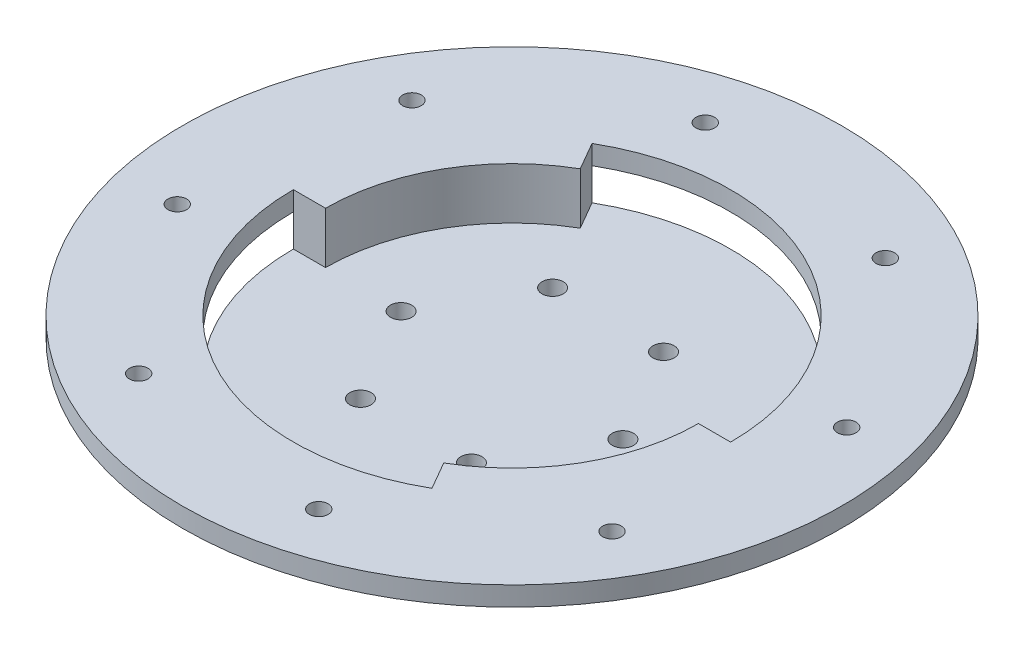
ISO-10303-21;
HEADER;
FILE_DESCRIPTION(('STEP AP214'),'2;1');
FILE_NAME('part.step','',(''),(''),'','','');
FILE_SCHEMA(('AUTOMOTIVE_DESIGN { 1 0 10303 214 1 1 1 1 }'));
ENDSEC;
DATA;
#1=APPLICATION_CONTEXT('core data for automotive mechanical design processes');
#2=APPLICATION_PROTOCOL_DEFINITION('international standard','automotive_design',2000,#1);
#3=PRODUCT_CONTEXT('',#1,'mechanical');
#4=PRODUCT('Part','Part','',(#3));
#5=PRODUCT_RELATED_PRODUCT_CATEGORY('part','',(#4));
#6=PRODUCT_DEFINITION_FORMATION('','',#4);
#7=PRODUCT_DEFINITION_CONTEXT('part definition',#1,'design');
#8=PRODUCT_DEFINITION('design','',#6,#7);
#9=PRODUCT_DEFINITION_SHAPE('','',#8);
#10=(LENGTH_UNIT() NAMED_UNIT(*) SI_UNIT(.MILLI.,.METRE.));
#11=(NAMED_UNIT(*) PLANE_ANGLE_UNIT() SI_UNIT($,.RADIAN.));
#12=(NAMED_UNIT(*) SI_UNIT($,.STERADIAN.) SOLID_ANGLE_UNIT());
#13=UNCERTAINTY_MEASURE_WITH_UNIT(LENGTH_MEASURE(1.E-05),#10,'distance_accuracy_value','');
#14=(GEOMETRIC_REPRESENTATION_CONTEXT(3) GLOBAL_UNCERTAINTY_ASSIGNED_CONTEXT((#13)) GLOBAL_UNIT_ASSIGNED_CONTEXT((#10,
#11,#12)) REPRESENTATION_CONTEXT('',''));
#15=CARTESIAN_POINT('',(0.,0.,0.));
#16=DIRECTION('',(0.,0.,1.));
#17=DIRECTION('',(1.,0.,0.));
#18=AXIS2_PLACEMENT_3D('',#15,#16,#17);
#19=CARTESIAN_POINT('',(0.,10.,0.));
#20=DIRECTION('',(0.,1.,0.));
#21=DIRECTION('',(0.,0.,1.));
#22=AXIS2_PLACEMENT_3D('',#19,#20,#21);
#23=CYLINDRICAL_SURFACE('',#22,51.25);
#24=CARTESIAN_POINT('',(0.,10.,0.));
#25=DIRECTION('',(0.,1.,0.));
#26=DIRECTION('',(0.,0.,1.));
#27=AXIS2_PLACEMENT_3D('',#24,#25,#26);
#28=CIRCLE('',#27,51.25);
#29=CARTESIAN_POINT('',(0.,10.,51.25));
#30=VERTEX_POINT('',#29);
#31=EDGE_CURVE('E212',#30,#30,#28,.T.);
#32=ORIENTED_EDGE('',*,*,#31,.T.);
#33=EDGE_LOOP('',(#32));
#34=FACE_BOUND('',#33,.T.);
#35=CARTESIAN_POINT('',(0.,13.,0.));
#36=DIRECTION('',(0.,1.,0.));
#37=DIRECTION('',(0.,0.,1.));
#38=AXIS2_PLACEMENT_3D('',#35,#36,#37);
#39=CIRCLE('',#38,51.25);
#40=CARTESIAN_POINT('',(0.,13.,51.25));
#41=VERTEX_POINT('',#40);
#42=EDGE_CURVE('E834',#41,#41,#39,.F.);
#43=ORIENTED_EDGE('',*,*,#42,.T.);
#44=EDGE_LOOP('',(#43));
#45=FACE_BOUND('',#44,.T.);
#46=ADVANCED_FACE('F45',(#34,#45),#23,.T.);
#47=CARTESIAN_POINT('',(0.,10.,0.));
#48=DIRECTION('',(0.,1.,0.));
#49=DIRECTION('',(0.,0.,1.));
#50=AXIS2_PLACEMENT_3D('',#47,#48,#49);
#51=PLANE('',#50);
#52=CARTESIAN_POINT('',(10.9998094168576,10.,41.0518476172853));
#53=DIRECTION('',(0.,-1.,0.));
#54=DIRECTION('',(0.,0.,-1.));
#55=AXIS2_PLACEMENT_3D('',#52,#53,#54);
#56=CIRCLE('',#55,1.775);
#57=CARTESIAN_POINT('',(10.9998094168576,10.,39.2768476172853));
#58=VERTEX_POINT('',#57);
#59=EDGE_CURVE('E833',#58,#58,#56,.T.);
#60=ORIENTED_EDGE('',*,*,#59,.F.);
#61=EDGE_LOOP('',(#60));
#62=FACE_BOUND('',#61,.T.);
#63=CARTESIAN_POINT('',(-21.2499999999997,10.,36.8060796608388));
#64=DIRECTION('',(0.,-1.,0.));
#65=DIRECTION('',(0.,0.,-1.));
#66=AXIS2_PLACEMENT_3D('',#63,#64,#65);
#67=CIRCLE('',#66,1.775);
#68=CARTESIAN_POINT('',(-21.2499999999997,10.,35.0310796608388));
#69=VERTEX_POINT('',#68);
#70=EDGE_CURVE('E277',#69,#69,#67,.T.);
#71=ORIENTED_EDGE('',*,*,#70,.F.);
#72=EDGE_LOOP('',(#71));
#73=FACE_BOUND('',#72,.T.);
#74=CARTESIAN_POINT('',(-36.8060796608386,10.,-21.25));
#75=DIRECTION('',(0.,-1.,0.));
#76=DIRECTION('',(0.,0.,-1.));
#77=AXIS2_PLACEMENT_3D('',#74,#75,#76);
#78=CIRCLE('',#77,1.775);
#79=CARTESIAN_POINT('',(-36.8060796608386,10.,-23.025));
#80=VERTEX_POINT('',#79);
#81=EDGE_CURVE('E266',#80,#80,#78,.T.);
#82=ORIENTED_EDGE('',*,*,#81,.F.);
#83=EDGE_LOOP('',(#82));
#84=FACE_BOUND('',#83,.T.);
#85=CARTESIAN_POINT('',(-10.9998094168573,10.,-41.0518476172854));
#86=DIRECTION('',(0.,-1.,0.));
#87=DIRECTION('',(0.,0.,-1.));
#88=AXIS2_PLACEMENT_3D('',#85,#86,#87);
#89=CIRCLE('',#88,1.775);
#90=CARTESIAN_POINT('',(-10.9998094168573,10.,-42.8268476172854));
#91=VERTEX_POINT('',#90);
#92=EDGE_CURVE('E262',#91,#91,#89,.T.);
#93=ORIENTED_EDGE('',*,*,#92,.F.);
#94=EDGE_LOOP('',(#93));
#95=FACE_BOUND('',#94,.T.);
#96=CARTESIAN_POINT('',(21.2499999999999,10.,-36.8060796608387));
#97=DIRECTION('',(0.,-1.,0.));
#98=DIRECTION('',(0.,0.,-1.));
#99=AXIS2_PLACEMENT_3D('',#96,#97,#98);
#100=CIRCLE('',#99,1.775);
#101=CARTESIAN_POINT('',(21.2499999999999,10.,-38.5810796608387));
#102=VERTEX_POINT('',#101);
#103=EDGE_CURVE('E257',#102,#102,#100,.T.);
#104=ORIENTED_EDGE('',*,*,#103,.F.);
#105=EDGE_LOOP('',(#104));
#106=FACE_BOUND('',#105,.T.);
#107=CARTESIAN_POINT('',(41.0518476172854,10.,-10.9998094168572));
#108=DIRECTION('',(0.,-1.,0.));
#109=DIRECTION('',(0.,0.,-1.));
#110=AXIS2_PLACEMENT_3D('',#107,#108,#109);
#111=CIRCLE('',#110,1.775);
#112=CARTESIAN_POINT('',(41.0518476172854,10.,-12.7748094168572));
#113=VERTEX_POINT('',#112);
#114=EDGE_CURVE('E252',#113,#113,#111,.T.);
#115=ORIENTED_EDGE('',*,*,#114,.F.);
#116=EDGE_LOOP('',(#115));
#117=FACE_BOUND('',#116,.T.);
#118=CARTESIAN_POINT('',(36.8060796608386,10.,21.25));
#119=DIRECTION('',(0.,-1.,0.));
#120=DIRECTION('',(0.,0.,-1.));
#121=AXIS2_PLACEMENT_3D('',#118,#119,#120);
#122=CIRCLE('',#121,1.775);
#123=CARTESIAN_POINT('',(36.8060796608386,10.,19.475));
#124=VERTEX_POINT('',#123);
#125=EDGE_CURVE('E247',#124,#124,#122,.T.);
#126=ORIENTED_EDGE('',*,*,#125,.F.);
#127=EDGE_LOOP('',(#126));
#128=FACE_BOUND('',#127,.T.);
#129=CARTESIAN_POINT('',(0.,10.,0.));
#130=DIRECTION('',(0.,1.,0.));
#131=DIRECTION('',(0.,0.,1.));
#132=AXIS2_PLACEMENT_3D('',#129,#130,#131);
#133=CIRCLE('',#132,34.);
#134=CARTESIAN_POINT('',(16.9999999999999,10.,29.444863728671));
#135=VERTEX_POINT('',#134);
#136=CARTESIAN_POINT('',(34.,10.,0.));
#137=VERTEX_POINT('',#136);
#138=EDGE_CURVE('E143',#135,#137,#133,.T.);
#139=ORIENTED_EDGE('',*,*,#138,.T.);
#140=CARTESIAN_POINT('',(-17.0000000000001,10.,-29.4448637286708));
#141=VERTEX_POINT('',#140);
#142=EDGE_CURVE('E154',#137,#141,#133,.T.);
#143=ORIENTED_EDGE('',*,*,#142,.T.);
#144=CARTESIAN_POINT('',(-34.,10.,0.));
#145=VERTEX_POINT('',#144);
#146=EDGE_CURVE('E145',#141,#145,#133,.T.);
#147=ORIENTED_EDGE('',*,*,#146,.T.);
#148=EDGE_CURVE('E129',#145,#135,#133,.T.);
#149=ORIENTED_EDGE('',*,*,#148,.T.);
#150=EDGE_LOOP('',(#139,#143,#147,#149));
#151=FACE_BOUND('',#150,.T.);
#152=ORIENTED_EDGE('',*,*,#31,.F.);
#153=EDGE_LOOP('',(#152));
#154=FACE_BOUND('',#153,.T.);
#155=CARTESIAN_POINT('',(-41.0518476172853,10.,10.9998094168574));
#156=DIRECTION('',(0.,-1.,0.));
#157=DIRECTION('',(0.,0.,-1.));
#158=AXIS2_PLACEMENT_3D('',#155,#156,#157);
#159=CIRCLE('',#158,1.775);
#160=CARTESIAN_POINT('',(-41.0518476172853,10.,9.22480941685744));
#161=VERTEX_POINT('',#160);
#162=EDGE_CURVE('E270',#161,#161,#159,.T.);
#163=ORIENTED_EDGE('',*,*,#162,.F.);
#164=EDGE_LOOP('',(#163));
#165=FACE_BOUND('',#164,.T.);
#166=ADVANCED_FACE('F140',(#62,#73,#84,#95,#106,#117,#128,#151,#154,#165),#51,.F.);
#167=CARTESIAN_POINT('',(0.,5.,0.));
#168=DIRECTION('',(0.,-1.,0.));
#169=DIRECTION('',(0.,0.,-1.));
#170=AXIS2_PLACEMENT_3D('',#167,#168,#169);
#171=CYLINDRICAL_SURFACE('',#170,34.);
#172=CARTESIAN_POINT('',(0.,0.,0.));
#173=DIRECTION('',(0.,1.,0.));
#174=DIRECTION('',(0.,0.,1.));
#175=AXIS2_PLACEMENT_3D('',#172,#173,#174);
#176=CIRCLE('',#175,34.);
#177=CARTESIAN_POINT('',(0.,0.,34.));
#178=VERTEX_POINT('',#177);
#179=EDGE_CURVE('E205',#178,#178,#176,.T.);
#180=ORIENTED_EDGE('',*,*,#179,.T.);
#181=EDGE_LOOP('',(#180));
#182=FACE_BOUND('',#181,.T.);
#183=ORIENTED_EDGE('',*,*,#138,.F.);
#184=DIRECTION('',(0.,-1.,0.));
#185=VECTOR('',#184,1.);
#186=CARTESIAN_POINT('',(16.9999999999999,13.,29.444863728671));
#187=LINE('',#186,#185);
#188=CARTESIAN_POINT('',(16.9999999999999,5.,29.444863728671));
#189=VERTEX_POINT('',#188);
#190=EDGE_CURVE('E135',#135,#189,#187,.T.);
#191=ORIENTED_EDGE('',*,*,#190,.T.);
#192=CARTESIAN_POINT('',(0.,5.,0.));
#193=DIRECTION('',(0.,1.,0.));
#194=DIRECTION('',(0.,0.,1.));
#195=AXIS2_PLACEMENT_3D('',#192,#193,#194);
#196=CIRCLE('',#195,34.);
#197=CARTESIAN_POINT('',(-34.,5.,0.));
#198=VERTEX_POINT('',#197);
#199=EDGE_CURVE('E11',#198,#189,#196,.T.);
#200=ORIENTED_EDGE('',*,*,#199,.F.);
#201=DIRECTION('',(0.,-1.,0.));
#202=VECTOR('',#201,1.);
#203=CARTESIAN_POINT('',(-34.,13.,0.));
#204=LINE('',#203,#202);
#205=EDGE_CURVE('E196',#145,#198,#204,.T.);
#206=ORIENTED_EDGE('',*,*,#205,.F.);
#207=ORIENTED_EDGE('',*,*,#146,.F.);
#208=DIRECTION('',(0.,-1.,0.));
#209=VECTOR('',#208,1.);
#210=CARTESIAN_POINT('',(-17.0000000000001,13.,-29.4448637286708));
#211=LINE('',#210,#209);
#212=CARTESIAN_POINT('',(-17.0000000000001,5.,-29.4448637286708));
#213=VERTEX_POINT('',#212);
#214=EDGE_CURVE('E200',#141,#213,#211,.T.);
#215=ORIENTED_EDGE('',*,*,#214,.T.);
#216=CARTESIAN_POINT('',(34.,5.,0.));
#217=VERTEX_POINT('',#216);
#218=EDGE_CURVE('E54',#217,#213,#196,.T.);
#219=ORIENTED_EDGE('',*,*,#218,.F.);
#220=DIRECTION('',(0.,-1.,0.));
#221=VECTOR('',#220,1.);
#222=CARTESIAN_POINT('',(34.,13.,0.));
#223=LINE('',#222,#221);
#224=EDGE_CURVE('E62',#137,#217,#223,.T.);
#225=ORIENTED_EDGE('',*,*,#224,.F.);
#226=EDGE_LOOP('',(#183,#191,#200,#206,#207,#215,#219,#225));
#227=FACE_BOUND('',#226,.T.);
#228=ADVANCED_FACE('F47',(#182,#227),#171,.T.);
#229=CARTESIAN_POINT('',(0.,5.,0.));
#230=DIRECTION('',(0.,1.,0.));
#231=DIRECTION('',(0.,0.,1.));
#232=AXIS2_PLACEMENT_3D('',#229,#230,#231);
#233=PLANE('',#232);
#234=CARTESIAN_POINT('',(17.25,5.,-2.40259201422788E-13));
#235=DIRECTION('',(0.,1.,0.));
#236=DIRECTION('',(0.,0.,1.));
#237=AXIS2_PLACEMENT_3D('',#234,#235,#236);
#238=CIRCLE('',#237,1.65);
#239=CARTESIAN_POINT('',(17.25,5.,1.64999999999976));
#240=VERTEX_POINT('',#239);
#241=EDGE_CURVE('E234',#240,#240,#238,.T.);
#242=ORIENTED_EDGE('',*,*,#241,.F.);
#243=EDGE_LOOP('',(#242));
#244=FACE_BOUND('',#243,.T.);
#245=CARTESIAN_POINT('',(8.62500000000017,5.,14.9389382152815));
#246=DIRECTION('',(0.,1.,0.));
#247=DIRECTION('',(0.,0.,1.));
#248=AXIS2_PLACEMENT_3D('',#245,#246,#247);
#249=CIRCLE('',#248,1.65);
#250=CARTESIAN_POINT('',(8.62500000000017,5.,16.5889382152815));
#251=VERTEX_POINT('',#250);
#252=EDGE_CURVE('E229',#251,#251,#249,.T.);
#253=ORIENTED_EDGE('',*,*,#252,.F.);
#254=EDGE_LOOP('',(#253));
#255=FACE_BOUND('',#254,.T.);
#256=CARTESIAN_POINT('',(-8.62499999999996,5.,14.9389382152816));
#257=DIRECTION('',(0.,1.,0.));
#258=DIRECTION('',(0.,0.,1.));
#259=AXIS2_PLACEMENT_3D('',#256,#257,#258);
#260=CIRCLE('',#259,1.65);
#261=CARTESIAN_POINT('',(-8.62499999999996,5.,16.5889382152816));
#262=VERTEX_POINT('',#261);
#263=EDGE_CURVE('E224',#262,#262,#260,.T.);
#264=ORIENTED_EDGE('',*,*,#263,.F.);
#265=EDGE_LOOP('',(#264));
#266=FACE_BOUND('',#265,.T.);
#267=CARTESIAN_POINT('',(-17.25,5.,1.196959198424E-13));
#268=DIRECTION('',(0.,1.,0.));
#269=DIRECTION('',(0.,0.,1.));
#270=AXIS2_PLACEMENT_3D('',#267,#268,#269);
#271=CIRCLE('',#270,1.65);
#272=CARTESIAN_POINT('',(-17.25,5.,1.65000000000012));
#273=VERTEX_POINT('',#272);
#274=EDGE_CURVE('E219',#273,#273,#271,.T.);
#275=ORIENTED_EDGE('',*,*,#274,.F.);
#276=EDGE_LOOP('',(#275));
#277=FACE_BOUND('',#276,.T.);
#278=CARTESIAN_POINT('',(-8.62500000000007,5.,-14.9389382152815));
#279=DIRECTION('',(0.,1.,0.));
#280=DIRECTION('',(0.,0.,1.));
#281=AXIS2_PLACEMENT_3D('',#278,#279,#280);
#282=CIRCLE('',#281,1.65);
#283=CARTESIAN_POINT('',(-8.62500000000007,5.,-13.2889382152815));
#284=VERTEX_POINT('',#283);
#285=EDGE_CURVE('E214',#284,#284,#282,.T.);
#286=ORIENTED_EDGE('',*,*,#285,.F.);
#287=EDGE_LOOP('',(#286));
#288=FACE_BOUND('',#287,.T.);
#289=CARTESIAN_POINT('',(8.62499999999996,5.,-14.9389382152816));
#290=DIRECTION('',(0.,1.,0.));
#291=DIRECTION('',(0.,0.,1.));
#292=AXIS2_PLACEMENT_3D('',#289,#290,#291);
#293=CIRCLE('',#292,1.65);
#294=CARTESIAN_POINT('',(8.62499999999996,5.,-13.2889382152816));
#295=VERTEX_POINT('',#294);
#296=EDGE_CURVE('E209',#295,#295,#293,.T.);
#297=ORIENTED_EDGE('',*,*,#296,.F.);
#298=EDGE_LOOP('',(#297));
#299=FACE_BOUND('',#298,.T.);
#300=ORIENTED_EDGE('',*,*,#199,.T.);
#301=DIRECTION('',(0.499999999999998,0.,0.86602540378444));
#302=VECTOR('',#301,1.);
#303=CARTESIAN_POINT('',(14.4999999999999,5.,25.1147367097488));
#304=LINE('',#303,#302);
#305=CARTESIAN_POINT('',(14.4999999999999,5.,25.1147367097488));
#306=VERTEX_POINT('',#305);
#307=EDGE_CURVE('E157',#306,#189,#304,.T.);
#308=ORIENTED_EDGE('',*,*,#307,.F.);
#309=CARTESIAN_POINT('',(0.,5.,0.));
#310=DIRECTION('',(0.,-1.,0.));
#311=DIRECTION('',(0.,0.,1.));
#312=AXIS2_PLACEMENT_3D('',#309,#310,#311);
#313=CIRCLE('',#312,29.);
#314=CARTESIAN_POINT('',(29.,5.,0.));
#315=VERTEX_POINT('',#314);
#316=EDGE_CURVE('E171',#315,#306,#313,.T.);
#317=ORIENTED_EDGE('',*,*,#316,.F.);
#318=DIRECTION('',(-1.,0.,0.));
#319=VECTOR('',#318,1.);
#320=CARTESIAN_POINT('',(29.,5.,0.));
#321=LINE('',#320,#319);
#322=EDGE_CURVE('E167',#217,#315,#321,.T.);
#323=ORIENTED_EDGE('',*,*,#322,.F.);
#324=ORIENTED_EDGE('',*,*,#218,.T.);
#325=DIRECTION('',(-0.500000000000004,0.,-0.866025403784436));
#326=VECTOR('',#325,1.);
#327=CARTESIAN_POINT('',(-14.5000000000001,5.,-25.1147367097487));
#328=LINE('',#327,#326);
#329=CARTESIAN_POINT('',(-14.5000000000001,5.,-25.1147367097487));
#330=VERTEX_POINT('',#329);
#331=EDGE_CURVE('E190',#330,#213,#328,.T.);
#332=ORIENTED_EDGE('',*,*,#331,.F.);
#333=CARTESIAN_POINT('',(0.,5.,0.));
#334=DIRECTION('',(0.,-1.,0.));
#335=DIRECTION('',(0.,0.,1.));
#336=AXIS2_PLACEMENT_3D('',#333,#334,#335);
#337=CIRCLE('',#336,29.);
#338=CARTESIAN_POINT('',(-29.,5.,0.));
#339=VERTEX_POINT('',#338);
#340=EDGE_CURVE('E70',#339,#330,#337,.T.);
#341=ORIENTED_EDGE('',*,*,#340,.F.);
#342=DIRECTION('',(1.,0.,0.));
#343=VECTOR('',#342,1.);
#344=CARTESIAN_POINT('',(-34.,5.,0.));
#345=LINE('',#344,#343);
#346=EDGE_CURVE('E183',#198,#339,#345,.T.);
#347=ORIENTED_EDGE('',*,*,#346,.F.);
#348=EDGE_LOOP('',(#300,#308,#317,#323,#324,#332,#341,#347));
#349=FACE_BOUND('',#348,.T.);
#350=ADVANCED_FACE('F346',(#244,#255,#266,#277,#288,#299,#349),#233,.T.);
#351=CARTESIAN_POINT('',(0.,0.,0.));
#352=DIRECTION('',(0.,1.,0.));
#353=DIRECTION('',(0.,0.,1.));
#354=AXIS2_PLACEMENT_3D('',#351,#352,#353);
#355=PLANE('',#354);
#356=CARTESIAN_POINT('',(17.25,0.,-2.40259201422788E-13));
#357=DIRECTION('',(0.,-1.,0.));
#358=DIRECTION('',(0.,0.,-1.));
#359=AXIS2_PLACEMENT_3D('',#356,#357,#358);
#360=CIRCLE('',#359,2.025);
#361=CARTESIAN_POINT('',(17.25,0.,-2.02500000000024));
#362=VERTEX_POINT('',#361);
#363=EDGE_CURVE('E242',#362,#362,#360,.T.);
#364=ORIENTED_EDGE('',*,*,#363,.F.);
#365=EDGE_LOOP('',(#364));
#366=FACE_BOUND('',#365,.T.);
#367=CARTESIAN_POINT('',(8.62500000000017,0.,14.9389382152815));
#368=DIRECTION('',(0.,-1.,0.));
#369=DIRECTION('',(0.,0.,-1.));
#370=AXIS2_PLACEMENT_3D('',#367,#368,#369);
#371=CIRCLE('',#370,2.025);
#372=CARTESIAN_POINT('',(8.62500000000017,0.,12.9139382152815));
#373=VERTEX_POINT('',#372);
#374=EDGE_CURVE('E237',#373,#373,#371,.T.);
#375=ORIENTED_EDGE('',*,*,#374,.F.);
#376=EDGE_LOOP('',(#375));
#377=FACE_BOUND('',#376,.T.);
#378=CARTESIAN_POINT('',(-8.62499999999996,0.,14.9389382152816));
#379=DIRECTION('',(0.,-1.,0.));
#380=DIRECTION('',(0.,0.,-1.));
#381=AXIS2_PLACEMENT_3D('',#378,#379,#380);
#382=CIRCLE('',#381,2.025);
#383=CARTESIAN_POINT('',(-8.62499999999996,0.,12.9139382152816));
#384=VERTEX_POINT('',#383);
#385=EDGE_CURVE('E232',#384,#384,#382,.T.);
#386=ORIENTED_EDGE('',*,*,#385,.F.);
#387=EDGE_LOOP('',(#386));
#388=FACE_BOUND('',#387,.T.);
#389=CARTESIAN_POINT('',(-17.25,0.,1.196959198424E-13));
#390=DIRECTION('',(0.,-1.,0.));
#391=DIRECTION('',(0.,0.,-1.));
#392=AXIS2_PLACEMENT_3D('',#389,#390,#391);
#393=CIRCLE('',#392,2.025);
#394=CARTESIAN_POINT('',(-17.25,0.,-2.02499999999988));
#395=VERTEX_POINT('',#394);
#396=EDGE_CURVE('E227',#395,#395,#393,.T.);
#397=ORIENTED_EDGE('',*,*,#396,.F.);
#398=EDGE_LOOP('',(#397));
#399=FACE_BOUND('',#398,.T.);
#400=CARTESIAN_POINT('',(-8.62500000000007,0.,-14.9389382152815));
#401=DIRECTION('',(0.,-1.,0.));
#402=DIRECTION('',(0.,0.,-1.));
#403=AXIS2_PLACEMENT_3D('',#400,#401,#402);
#404=CIRCLE('',#403,2.025);
#405=CARTESIAN_POINT('',(-8.62500000000007,0.,-16.9639382152815));
#406=VERTEX_POINT('',#405);
#407=EDGE_CURVE('E222',#406,#406,#404,.T.);
#408=ORIENTED_EDGE('',*,*,#407,.F.);
#409=EDGE_LOOP('',(#408));
#410=FACE_BOUND('',#409,.T.);
#411=CARTESIAN_POINT('',(8.62499999999996,0.,-14.9389382152816));
#412=DIRECTION('',(0.,-1.,0.));
#413=DIRECTION('',(0.,0.,-1.));
#414=AXIS2_PLACEMENT_3D('',#411,#412,#413);
#415=CIRCLE('',#414,2.025);
#416=CARTESIAN_POINT('',(8.62499999999996,0.,-16.9639382152816));
#417=VERTEX_POINT('',#416);
#418=EDGE_CURVE('E217',#417,#417,#415,.T.);
#419=ORIENTED_EDGE('',*,*,#418,.F.);
#420=EDGE_LOOP('',(#419));
#421=FACE_BOUND('',#420,.T.);
#422=ORIENTED_EDGE('',*,*,#179,.F.);
#423=EDGE_LOOP('',(#422));
#424=FACE_BOUND('',#423,.T.);
#425=ADVANCED_FACE('F361',(#366,#377,#388,#399,#410,#421,#424),#355,.F.);
#426=CARTESIAN_POINT('',(0.,13.,0.));
#427=DIRECTION('',(0.,-1.,0.));
#428=DIRECTION('',(0.,0.,-1.));
#429=AXIS2_PLACEMENT_3D('',#426,#427,#428);
#430=CYLINDRICAL_SURFACE('',#429,29.);
#431=ORIENTED_EDGE('',*,*,#340,.T.);
#432=DIRECTION('',(0.,-1.,0.));
#433=VECTOR('',#432,1.);
#434=CARTESIAN_POINT('',(-14.5000000000001,13.,-25.1147367097487));
#435=LINE('',#434,#433);
#436=CARTESIAN_POINT('',(-14.5000000000001,13.,-25.1147367097487));
#437=VERTEX_POINT('',#436);
#438=EDGE_CURVE('E203',#437,#330,#435,.T.);
#439=ORIENTED_EDGE('',*,*,#438,.F.);
#440=CARTESIAN_POINT('',(0.,13.,0.));
#441=DIRECTION('',(0.,-1.,0.));
#442=DIRECTION('',(0.,0.,1.));
#443=AXIS2_PLACEMENT_3D('',#440,#441,#442);
#444=CIRCLE('',#443,29.);
#445=CARTESIAN_POINT('',(-29.,13.,0.));
#446=VERTEX_POINT('',#445);
#447=EDGE_CURVE('E179',#446,#437,#444,.T.);
#448=ORIENTED_EDGE('',*,*,#447,.F.);
#449=DIRECTION('',(0.,-1.,0.));
#450=VECTOR('',#449,1.);
#451=CARTESIAN_POINT('',(-29.,13.,0.));
#452=LINE('',#451,#450);
#453=EDGE_CURVE('E188',#446,#339,#452,.T.);
#454=ORIENTED_EDGE('',*,*,#453,.T.);
#455=EDGE_LOOP('',(#431,#439,#448,#454));
#456=FACE_BOUND('',#455,.T.);
#457=ADVANCED_FACE('F359',(#456),#430,.F.);
#458=CARTESIAN_POINT('',(-14.5000000000001,13.,-25.1147367097487));
#459=DIRECTION('',(-0.866025403784436,0.,0.500000000000004));
#460=DIRECTION('',(0.500000000000004,0.,0.866025403784436));
#461=AXIS2_PLACEMENT_3D('',#458,#459,#460);
#462=PLANE('',#461);
#463=ORIENTED_EDGE('',*,*,#331,.T.);
#464=ORIENTED_EDGE('',*,*,#214,.F.);
#465=CARTESIAN_POINT('',(-17.0000000000001,13.,-29.4448637286708));
#466=VERTEX_POINT('',#465);
#467=EDGE_CURVE('E201',#466,#141,#211,.T.);
#468=ORIENTED_EDGE('',*,*,#467,.F.);
#469=DIRECTION('',(-0.500000000000004,0.,-0.866025403784436));
#470=VECTOR('',#469,1.);
#471=CARTESIAN_POINT('',(-14.5000000000001,13.,-25.1147367097487));
#472=LINE('',#471,#470);
#473=EDGE_CURVE('E182',#437,#466,#472,.T.);
#474=ORIENTED_EDGE('',*,*,#473,.F.);
#475=ORIENTED_EDGE('',*,*,#438,.T.);
#476=EDGE_LOOP('',(#463,#464,#468,#474,#475));
#477=FACE_BOUND('',#476,.T.);
#478=ADVANCED_FACE('F344',(#477),#462,.F.);
#479=CARTESIAN_POINT('',(-34.,13.,0.));
#480=DIRECTION('',(0.,0.,-1.));
#481=DIRECTION('',(-1.,0.,0.));
#482=AXIS2_PLACEMENT_3D('',#479,#480,#481);
#483=PLANE('',#482);
#484=ORIENTED_EDGE('',*,*,#346,.T.);
#485=ORIENTED_EDGE('',*,*,#453,.F.);
#486=DIRECTION('',(1.,0.,0.));
#487=VECTOR('',#486,1.);
#488=CARTESIAN_POINT('',(-34.,13.,0.));
#489=LINE('',#488,#487);
#490=CARTESIAN_POINT('',(-34.,13.,0.));
#491=VERTEX_POINT('',#490);
#492=EDGE_CURVE('E186',#491,#446,#489,.T.);
#493=ORIENTED_EDGE('',*,*,#492,.F.);
#494=EDGE_CURVE('E197',#491,#145,#204,.T.);
#495=ORIENTED_EDGE('',*,*,#494,.T.);
#496=ORIENTED_EDGE('',*,*,#205,.T.);
#497=EDGE_LOOP('',(#484,#485,#493,#495,#496));
#498=FACE_BOUND('',#497,.T.);
#499=ADVANCED_FACE('F357',(#498),#483,.F.);
#500=CARTESIAN_POINT('',(0.,13.,0.));
#501=DIRECTION('',(0.,1.,0.));
#502=DIRECTION('',(0.,0.,1.));
#503=AXIS2_PLACEMENT_3D('',#500,#501,#502);
#504=PLANE('',#503);
#505=CARTESIAN_POINT('',(10.9998094168576,13.,41.0518476172853));
#506=DIRECTION('',(0.,1.,0.));
#507=DIRECTION('',(0.,0.,1.));
#508=AXIS2_PLACEMENT_3D('',#505,#506,#507);
#509=CIRCLE('',#508,1.44999999999999);
#510=CARTESIAN_POINT('',(10.9998094168576,13.,42.5018476172853));
#511=VERTEX_POINT('',#510);
#512=EDGE_CURVE('E49',#511,#511,#509,.T.);
#513=ORIENTED_EDGE('',*,*,#512,.F.);
#514=EDGE_LOOP('',(#513));
#515=FACE_BOUND('',#514,.T.);
#516=CARTESIAN_POINT('',(-21.2499999999997,13.,36.8060796608388));
#517=DIRECTION('',(0.,1.,0.));
#518=DIRECTION('',(0.,0.,1.));
#519=AXIS2_PLACEMENT_3D('',#516,#517,#518);
#520=CIRCLE('',#519,1.44999999999999);
#521=CARTESIAN_POINT('',(-21.2499999999997,13.,38.2560796608388));
#522=VERTEX_POINT('',#521);
#523=EDGE_CURVE('E268',#522,#522,#520,.T.);
#524=ORIENTED_EDGE('',*,*,#523,.F.);
#525=EDGE_LOOP('',(#524));
#526=FACE_BOUND('',#525,.T.);
#527=CARTESIAN_POINT('',(-41.0518476172853,13.,10.9998094168574));
#528=DIRECTION('',(0.,1.,0.));
#529=DIRECTION('',(0.,0.,1.));
#530=AXIS2_PLACEMENT_3D('',#527,#528,#529);
#531=CIRCLE('',#530,1.44999999999999);
#532=CARTESIAN_POINT('',(-41.0518476172853,13.,12.4498094168574));
#533=VERTEX_POINT('',#532);
#534=EDGE_CURVE('E264',#533,#533,#531,.T.);
#535=ORIENTED_EDGE('',*,*,#534,.F.);
#536=EDGE_LOOP('',(#535));
#537=FACE_BOUND('',#536,.T.);
#538=CARTESIAN_POINT('',(-36.8060796608386,13.,-21.25));
#539=DIRECTION('',(0.,1.,0.));
#540=DIRECTION('',(0.,0.,1.));
#541=AXIS2_PLACEMENT_3D('',#538,#539,#540);
#542=CIRCLE('',#541,1.44999999999999);
#543=CARTESIAN_POINT('',(-36.8060796608386,13.,-19.8000000000001));
#544=VERTEX_POINT('',#543);
#545=EDGE_CURVE('E259',#544,#544,#542,.T.);
#546=ORIENTED_EDGE('',*,*,#545,.F.);
#547=EDGE_LOOP('',(#546));
#548=FACE_BOUND('',#547,.T.);
#549=CARTESIAN_POINT('',(-10.9998094168573,13.,-41.0518476172854));
#550=DIRECTION('',(0.,1.,0.));
#551=DIRECTION('',(0.,0.,1.));
#552=AXIS2_PLACEMENT_3D('',#549,#550,#551);
#553=CIRCLE('',#552,1.44999999999999);
#554=CARTESIAN_POINT('',(-10.9998094168573,13.,-39.6018476172854));
#555=VERTEX_POINT('',#554);
#556=EDGE_CURVE('E254',#555,#555,#553,.T.);
#557=ORIENTED_EDGE('',*,*,#556,.F.);
#558=EDGE_LOOP('',(#557));
#559=FACE_BOUND('',#558,.T.);
#560=CARTESIAN_POINT('',(21.2499999999999,13.,-36.8060796608387));
#561=DIRECTION('',(0.,1.,0.));
#562=DIRECTION('',(0.,0.,1.));
#563=AXIS2_PLACEMENT_3D('',#560,#561,#562);
#564=CIRCLE('',#563,1.44999999999999);
#565=CARTESIAN_POINT('',(21.2499999999999,13.,-35.3560796608387));
#566=VERTEX_POINT('',#565);
#567=EDGE_CURVE('E249',#566,#566,#564,.T.);
#568=ORIENTED_EDGE('',*,*,#567,.F.);
#569=EDGE_LOOP('',(#568));
#570=FACE_BOUND('',#569,.T.);
#571=CARTESIAN_POINT('',(41.0518476172854,13.,-10.9998094168572));
#572=DIRECTION('',(0.,1.,0.));
#573=DIRECTION('',(0.,0.,1.));
#574=AXIS2_PLACEMENT_3D('',#571,#572,#573);
#575=CIRCLE('',#574,1.44999999999999);
#576=CARTESIAN_POINT('',(41.0518476172854,13.,-9.54980941685716));
#577=VERTEX_POINT('',#576);
#578=EDGE_CURVE('E244',#577,#577,#575,.T.);
#579=ORIENTED_EDGE('',*,*,#578,.F.);
#580=EDGE_LOOP('',(#579));
#581=FACE_BOUND('',#580,.T.);
#582=CARTESIAN_POINT('',(36.8060796608386,13.,21.25));
#583=DIRECTION('',(0.,1.,0.));
#584=DIRECTION('',(0.,0.,1.));
#585=AXIS2_PLACEMENT_3D('',#582,#583,#584);
#586=CIRCLE('',#585,1.44999999999999);
#587=CARTESIAN_POINT('',(36.8060796608386,13.,22.7));
#588=VERTEX_POINT('',#587);
#589=EDGE_CURVE('E239',#588,#588,#586,.T.);
#590=ORIENTED_EDGE('',*,*,#589,.F.);
#591=EDGE_LOOP('',(#590));
#592=FACE_BOUND('',#591,.T.);
#593=ORIENTED_EDGE('',*,*,#447,.T.);
#594=ORIENTED_EDGE('',*,*,#473,.T.);
#595=CARTESIAN_POINT('',(0.,13.,0.));
#596=DIRECTION('',(0.,1.,0.));
#597=DIRECTION('',(0.,0.,1.));
#598=AXIS2_PLACEMENT_3D('',#595,#596,#597);
#599=CIRCLE('',#598,34.);
#600=CARTESIAN_POINT('',(34.,13.,0.));
#601=VERTEX_POINT('',#600);
#602=EDGE_CURVE('E147',#601,#466,#599,.T.);
#603=ORIENTED_EDGE('',*,*,#602,.F.);
#604=DIRECTION('',(-1.,0.,0.));
#605=VECTOR('',#604,1.);
#606=CARTESIAN_POINT('',(29.,13.,0.));
#607=LINE('',#606,#605);
#608=CARTESIAN_POINT('',(29.,13.,0.));
#609=VERTEX_POINT('',#608);
#610=EDGE_CURVE('E166',#601,#609,#607,.T.);
#611=ORIENTED_EDGE('',*,*,#610,.T.);
#612=CARTESIAN_POINT('',(0.,13.,0.));
#613=DIRECTION('',(0.,-1.,0.));
#614=DIRECTION('',(0.,0.,1.));
#615=AXIS2_PLACEMENT_3D('',#612,#613,#614);
#616=CIRCLE('',#615,29.);
#617=CARTESIAN_POINT('',(14.4999999999999,13.,25.1147367097488));
#618=VERTEX_POINT('',#617);
#619=EDGE_CURVE('E169',#609,#618,#616,.T.);
#620=ORIENTED_EDGE('',*,*,#619,.T.);
#621=DIRECTION('',(0.499999999999998,0.,0.86602540378444));
#622=VECTOR('',#621,1.);
#623=CARTESIAN_POINT('',(14.4999999999999,13.,25.1147367097488));
#624=LINE('',#623,#622);
#625=CARTESIAN_POINT('',(16.9999999999999,13.,29.444863728671));
#626=VERTEX_POINT('',#625);
#627=EDGE_CURVE('E175',#618,#626,#624,.T.);
#628=ORIENTED_EDGE('',*,*,#627,.T.);
#629=EDGE_CURVE('E131',#491,#626,#599,.T.);
#630=ORIENTED_EDGE('',*,*,#629,.F.);
#631=ORIENTED_EDGE('',*,*,#492,.T.);
#632=EDGE_LOOP('',(#593,#594,#603,#611,#620,#628,#630,#631));
#633=FACE_BOUND('',#632,.T.);
#634=ORIENTED_EDGE('',*,*,#42,.F.);
#635=EDGE_LOOP('',(#634));
#636=FACE_BOUND('',#635,.T.);
#637=ADVANCED_FACE('F338',(#515,#526,#537,#548,#559,#570,#581,#592,#633,#636),#504,.T.);
#638=CARTESIAN_POINT('',(0.,13.,0.));
#639=DIRECTION('',(0.,-1.,0.));
#640=DIRECTION('',(0.,0.,-1.));
#641=AXIS2_PLACEMENT_3D('',#638,#639,#640);
#642=CYLINDRICAL_SURFACE('',#641,29.);
#643=ORIENTED_EDGE('',*,*,#316,.T.);
#644=DIRECTION('',(0.,-1.,0.));
#645=VECTOR('',#644,1.);
#646=CARTESIAN_POINT('',(14.4999999999999,13.,25.1147367097488));
#647=LINE('',#646,#645);
#648=EDGE_CURVE('E153',#618,#306,#647,.T.);
#649=ORIENTED_EDGE('',*,*,#648,.F.);
#650=ORIENTED_EDGE('',*,*,#619,.F.);
#651=DIRECTION('',(0.,-1.,0.));
#652=VECTOR('',#651,1.);
#653=CARTESIAN_POINT('',(29.,13.,0.));
#654=LINE('',#653,#652);
#655=EDGE_CURVE('E163',#609,#315,#654,.T.);
#656=ORIENTED_EDGE('',*,*,#655,.T.);
#657=EDGE_LOOP('',(#643,#649,#650,#656));
#658=FACE_BOUND('',#657,.T.);
#659=ADVANCED_FACE('F352',(#658),#642,.F.);
#660=CARTESIAN_POINT('',(14.4999999999999,13.,25.1147367097488));
#661=DIRECTION('',(0.86602540378444,0.,-0.499999999999998));
#662=DIRECTION('',(-0.499999999999998,0.,-0.86602540378444));
#663=AXIS2_PLACEMENT_3D('',#660,#661,#662);
#664=PLANE('',#663);
#665=ORIENTED_EDGE('',*,*,#307,.T.);
#666=ORIENTED_EDGE('',*,*,#190,.F.);
#667=EDGE_CURVE('E125',#626,#135,#187,.T.);
#668=ORIENTED_EDGE('',*,*,#667,.F.);
#669=ORIENTED_EDGE('',*,*,#627,.F.);
#670=ORIENTED_EDGE('',*,*,#648,.T.);
#671=EDGE_LOOP('',(#665,#666,#668,#669,#670));
#672=FACE_BOUND('',#671,.T.);
#673=ADVANCED_FACE('F155',(#672),#664,.F.);
#674=CARTESIAN_POINT('',(29.,13.,0.));
#675=DIRECTION('',(0.,0.,1.));
#676=DIRECTION('',(1.,0.,0.));
#677=AXIS2_PLACEMENT_3D('',#674,#675,#676);
#678=PLANE('',#677);
#679=ORIENTED_EDGE('',*,*,#322,.T.);
#680=ORIENTED_EDGE('',*,*,#655,.F.);
#681=ORIENTED_EDGE('',*,*,#610,.F.);
#682=EDGE_CURVE('E161',#601,#137,#223,.T.);
#683=ORIENTED_EDGE('',*,*,#682,.T.);
#684=ORIENTED_EDGE('',*,*,#224,.T.);
#685=EDGE_LOOP('',(#679,#680,#681,#683,#684));
#686=FACE_BOUND('',#685,.T.);
#687=ADVANCED_FACE('F349',(#686),#678,.F.);
#688=CARTESIAN_POINT('',(0.,10.,0.));
#689=DIRECTION('',(0.,1.,0.));
#690=DIRECTION('',(0.,0.,1.));
#691=AXIS2_PLACEMENT_3D('',#688,#689,#690);
#692=CYLINDRICAL_SURFACE('',#691,34.);
#693=ORIENTED_EDGE('',*,*,#602,.T.);
#694=ORIENTED_EDGE('',*,*,#467,.T.);
#695=ORIENTED_EDGE('',*,*,#142,.F.);
#696=ORIENTED_EDGE('',*,*,#682,.F.);
#697=EDGE_LOOP('',(#693,#694,#695,#696));
#698=FACE_BOUND('',#697,.T.);
#699=ADVANCED_FACE('F334',(#698),#692,.F.);
#700=ORIENTED_EDGE('',*,*,#148,.F.);
#701=ORIENTED_EDGE('',*,*,#494,.F.);
#702=ORIENTED_EDGE('',*,*,#629,.T.);
#703=ORIENTED_EDGE('',*,*,#667,.T.);
#704=EDGE_LOOP('',(#700,#701,#702,#703));
#705=FACE_BOUND('',#704,.T.);
#706=ADVANCED_FACE('F127',(#705),#692,.F.);
#707=CARTESIAN_POINT('',(8.62499999999996,0.,-14.9389382152816));
#708=DIRECTION('',(0.,-1.,0.));
#709=DIRECTION('',(0.,0.,-1.));
#710=AXIS2_PLACEMENT_3D('',#707,#708,#709);
#711=CYLINDRICAL_SURFACE('',#710,1.65);
#712=ORIENTED_EDGE('',*,*,#296,.T.);
#713=EDGE_LOOP('',(#712));
#714=FACE_BOUND('',#713,.T.);
#715=CARTESIAN_POINT('',(8.62499999999996,0.375,-14.9389382152816));
#716=DIRECTION('',(0.,-1.,0.));
#717=DIRECTION('',(0.,0.,-1.));
#718=AXIS2_PLACEMENT_3D('',#715,#716,#717);
#719=CIRCLE('',#718,1.65);
#720=CARTESIAN_POINT('',(8.62499999999996,0.375,-16.5889382152816));
#721=VERTEX_POINT('',#720);
#722=EDGE_CURVE('E213',#721,#721,#719,.T.);
#723=ORIENTED_EDGE('',*,*,#722,.T.);
#724=EDGE_LOOP('',(#723));
#725=FACE_BOUND('',#724,.T.);
#726=ADVANCED_FACE('F384',(#714,#725),#711,.F.);
#727=CARTESIAN_POINT('',(8.62499999999996,0.,-14.9389382152816));
#728=DIRECTION('',(0.,-1.,0.));
#729=DIRECTION('',(0.,0.,-1.));
#730=AXIS2_PLACEMENT_3D('',#727,#728,#729);
#731=CONICAL_SURFACE('',#730,2.025,0.785398163397446);
#732=ORIENTED_EDGE('',*,*,#722,.F.);
#733=EDGE_LOOP('',(#732));
#734=FACE_BOUND('',#733,.T.);
#735=ORIENTED_EDGE('',*,*,#418,.T.);
#736=EDGE_LOOP('',(#735));
#737=FACE_BOUND('',#736,.T.);
#738=ADVANCED_FACE('F435',(#734,#737),#731,.F.);
#739=CARTESIAN_POINT('',(-8.62500000000007,0.,-14.9389382152815));
#740=DIRECTION('',(0.,-1.,0.));
#741=DIRECTION('',(0.,0.,-1.));
#742=AXIS2_PLACEMENT_3D('',#739,#740,#741);
#743=CYLINDRICAL_SURFACE('',#742,1.65);
#744=ORIENTED_EDGE('',*,*,#285,.T.);
#745=EDGE_LOOP('',(#744));
#746=FACE_BOUND('',#745,.T.);
#747=CARTESIAN_POINT('',(-8.62500000000007,0.375,-14.9389382152815));
#748=DIRECTION('',(0.,-1.,0.));
#749=DIRECTION('',(0.,0.,-1.));
#750=AXIS2_PLACEMENT_3D('',#747,#748,#749);
#751=CIRCLE('',#750,1.65);
#752=CARTESIAN_POINT('',(-8.62500000000007,0.375,-16.5889382152815));
#753=VERTEX_POINT('',#752);
#754=EDGE_CURVE('E218',#753,#753,#751,.T.);
#755=ORIENTED_EDGE('',*,*,#754,.T.);
#756=EDGE_LOOP('',(#755));
#757=FACE_BOUND('',#756,.T.);
#758=ADVANCED_FACE('F446',(#746,#757),#743,.F.);
#759=CARTESIAN_POINT('',(-8.62500000000007,0.,-14.9389382152815));
#760=DIRECTION('',(0.,-1.,0.));
#761=DIRECTION('',(0.,0.,-1.));
#762=AXIS2_PLACEMENT_3D('',#759,#760,#761);
#763=CONICAL_SURFACE('',#762,2.025,0.785398163397446);
#764=ORIENTED_EDGE('',*,*,#754,.F.);
#765=EDGE_LOOP('',(#764));
#766=FACE_BOUND('',#765,.T.);
#767=ORIENTED_EDGE('',*,*,#407,.T.);
#768=EDGE_LOOP('',(#767));
#769=FACE_BOUND('',#768,.T.);
#770=ADVANCED_FACE('F467',(#766,#769),#763,.F.);
#771=CARTESIAN_POINT('',(-17.25,0.,1.196959198424E-13));
#772=DIRECTION('',(0.,-1.,0.));
#773=DIRECTION('',(0.,0.,-1.));
#774=AXIS2_PLACEMENT_3D('',#771,#772,#773);
#775=CYLINDRICAL_SURFACE('',#774,1.65);
#776=ORIENTED_EDGE('',*,*,#274,.T.);
#777=EDGE_LOOP('',(#776));
#778=FACE_BOUND('',#777,.T.);
#779=CARTESIAN_POINT('',(-17.25,0.375,1.196959198424E-13));
#780=DIRECTION('',(0.,-1.,0.));
#781=DIRECTION('',(0.,0.,-1.));
#782=AXIS2_PLACEMENT_3D('',#779,#780,#781);
#783=CIRCLE('',#782,1.65);
#784=CARTESIAN_POINT('',(-17.25,0.375,-1.64999999999988));
#785=VERTEX_POINT('',#784);
#786=EDGE_CURVE('E223',#785,#785,#783,.T.);
#787=ORIENTED_EDGE('',*,*,#786,.T.);
#788=EDGE_LOOP('',(#787));
#789=FACE_BOUND('',#788,.T.);
#790=ADVANCED_FACE('F479',(#778,#789),#775,.F.);
#791=CARTESIAN_POINT('',(-17.25,0.,1.196959198424E-13));
#792=DIRECTION('',(0.,-1.,0.));
#793=DIRECTION('',(0.,0.,-1.));
#794=AXIS2_PLACEMENT_3D('',#791,#792,#793);
#795=CONICAL_SURFACE('',#794,2.025,0.785398163397446);
#796=ORIENTED_EDGE('',*,*,#786,.F.);
#797=EDGE_LOOP('',(#796));
#798=FACE_BOUND('',#797,.T.);
#799=ORIENTED_EDGE('',*,*,#396,.T.);
#800=EDGE_LOOP('',(#799));
#801=FACE_BOUND('',#800,.T.);
#802=ADVANCED_FACE('F489',(#798,#801),#795,.F.);
#803=CARTESIAN_POINT('',(-8.62499999999996,0.,14.9389382152816));
#804=DIRECTION('',(0.,-1.,0.));
#805=DIRECTION('',(0.,0.,-1.));
#806=AXIS2_PLACEMENT_3D('',#803,#804,#805);
#807=CYLINDRICAL_SURFACE('',#806,1.65);
#808=ORIENTED_EDGE('',*,*,#263,.T.);
#809=EDGE_LOOP('',(#808));
#810=FACE_BOUND('',#809,.T.);
#811=CARTESIAN_POINT('',(-8.62499999999996,0.375,14.9389382152816));
#812=DIRECTION('',(0.,-1.,0.));
#813=DIRECTION('',(0.,0.,-1.));
#814=AXIS2_PLACEMENT_3D('',#811,#812,#813);
#815=CIRCLE('',#814,1.65);
#816=CARTESIAN_POINT('',(-8.62499999999996,0.375,13.2889382152816));
#817=VERTEX_POINT('',#816);
#818=EDGE_CURVE('E228',#817,#817,#815,.T.);
#819=ORIENTED_EDGE('',*,*,#818,.T.);
#820=EDGE_LOOP('',(#819));
#821=FACE_BOUND('',#820,.T.);
#822=ADVANCED_FACE('F501',(#810,#821),#807,.F.);
#823=CARTESIAN_POINT('',(-8.62499999999996,0.,14.9389382152816));
#824=DIRECTION('',(0.,-1.,0.));
#825=DIRECTION('',(0.,0.,-1.));
#826=AXIS2_PLACEMENT_3D('',#823,#824,#825);
#827=CONICAL_SURFACE('',#826,2.025,0.785398163397446);
#828=ORIENTED_EDGE('',*,*,#818,.F.);
#829=EDGE_LOOP('',(#828));
#830=FACE_BOUND('',#829,.T.);
#831=ORIENTED_EDGE('',*,*,#385,.T.);
#832=EDGE_LOOP('',(#831));
#833=FACE_BOUND('',#832,.T.);
#834=ADVANCED_FACE('F511',(#830,#833),#827,.F.);
#835=CARTESIAN_POINT('',(8.62500000000017,0.,14.9389382152815));
#836=DIRECTION('',(0.,-1.,0.));
#837=DIRECTION('',(0.,0.,-1.));
#838=AXIS2_PLACEMENT_3D('',#835,#836,#837);
#839=CYLINDRICAL_SURFACE('',#838,1.65);
#840=ORIENTED_EDGE('',*,*,#252,.T.);
#841=EDGE_LOOP('',(#840));
#842=FACE_BOUND('',#841,.T.);
#843=CARTESIAN_POINT('',(8.62500000000017,0.375,14.9389382152815));
#844=DIRECTION('',(0.,-1.,0.));
#845=DIRECTION('',(0.,0.,-1.));
#846=AXIS2_PLACEMENT_3D('',#843,#844,#845);
#847=CIRCLE('',#846,1.65);
#848=CARTESIAN_POINT('',(8.62500000000017,0.375,13.2889382152815));
#849=VERTEX_POINT('',#848);
#850=EDGE_CURVE('E233',#849,#849,#847,.T.);
#851=ORIENTED_EDGE('',*,*,#850,.T.);
#852=EDGE_LOOP('',(#851));
#853=FACE_BOUND('',#852,.T.);
#854=ADVANCED_FACE('F523',(#842,#853),#839,.F.);
#855=CARTESIAN_POINT('',(8.62500000000017,0.,14.9389382152815));
#856=DIRECTION('',(0.,-1.,0.));
#857=DIRECTION('',(0.,0.,-1.));
#858=AXIS2_PLACEMENT_3D('',#855,#856,#857);
#859=CONICAL_SURFACE('',#858,2.025,0.785398163397446);
#860=ORIENTED_EDGE('',*,*,#850,.F.);
#861=EDGE_LOOP('',(#860));
#862=FACE_BOUND('',#861,.T.);
#863=ORIENTED_EDGE('',*,*,#374,.T.);
#864=EDGE_LOOP('',(#863));
#865=FACE_BOUND('',#864,.T.);
#866=ADVANCED_FACE('F533',(#862,#865),#859,.F.);
#867=CARTESIAN_POINT('',(17.25,0.,-2.40259201422788E-13));
#868=DIRECTION('',(0.,-1.,0.));
#869=DIRECTION('',(0.,0.,-1.));
#870=AXIS2_PLACEMENT_3D('',#867,#868,#869);
#871=CYLINDRICAL_SURFACE('',#870,1.65);
#872=ORIENTED_EDGE('',*,*,#241,.T.);
#873=EDGE_LOOP('',(#872));
#874=FACE_BOUND('',#873,.T.);
#875=CARTESIAN_POINT('',(17.25,0.375,-2.40259201422788E-13));
#876=DIRECTION('',(0.,-1.,0.));
#877=DIRECTION('',(0.,0.,-1.));
#878=AXIS2_PLACEMENT_3D('',#875,#876,#877);
#879=CIRCLE('',#878,1.65);
#880=CARTESIAN_POINT('',(17.25,0.375,-1.65000000000024));
#881=VERTEX_POINT('',#880);
#882=EDGE_CURVE('E238',#881,#881,#879,.T.);
#883=ORIENTED_EDGE('',*,*,#882,.T.);
#884=EDGE_LOOP('',(#883));
#885=FACE_BOUND('',#884,.T.);
#886=ADVANCED_FACE('F545',(#874,#885),#871,.F.);
#887=CARTESIAN_POINT('',(17.25,0.,-2.40259201422788E-13));
#888=DIRECTION('',(0.,-1.,0.));
#889=DIRECTION('',(0.,0.,-1.));
#890=AXIS2_PLACEMENT_3D('',#887,#888,#889);
#891=CONICAL_SURFACE('',#890,2.025,0.785398163397446);
#892=ORIENTED_EDGE('',*,*,#882,.F.);
#893=EDGE_LOOP('',(#892));
#894=FACE_BOUND('',#893,.T.);
#895=ORIENTED_EDGE('',*,*,#363,.T.);
#896=EDGE_LOOP('',(#895));
#897=FACE_BOUND('',#896,.T.);
#898=ADVANCED_FACE('F555',(#894,#897),#891,.F.);
#899=CARTESIAN_POINT('',(36.8060796608386,10.,21.25));
#900=DIRECTION('',(0.,-1.,0.));
#901=DIRECTION('',(0.,0.,-1.));
#902=AXIS2_PLACEMENT_3D('',#899,#900,#901);
#903=CYLINDRICAL_SURFACE('',#902,1.44999999999999);
#904=ORIENTED_EDGE('',*,*,#589,.T.);
#905=EDGE_LOOP('',(#904));
#906=FACE_BOUND('',#905,.T.);
#907=CARTESIAN_POINT('',(36.8060796608386,10.325,21.25));
#908=DIRECTION('',(0.,-1.,0.));
#909=DIRECTION('',(0.,0.,-1.));
#910=AXIS2_PLACEMENT_3D('',#907,#908,#909);
#911=CIRCLE('',#910,1.44999999999999);
#912=CARTESIAN_POINT('',(36.8060796608386,10.325,19.8000000000001));
#913=VERTEX_POINT('',#912);
#914=EDGE_CURVE('E243',#913,#913,#911,.T.);
#915=ORIENTED_EDGE('',*,*,#914,.T.);
#916=EDGE_LOOP('',(#915));
#917=FACE_BOUND('',#916,.T.);
#918=ADVANCED_FACE('F567',(#906,#917),#903,.F.);
#919=CARTESIAN_POINT('',(36.8060796608386,10.,21.25));
#920=DIRECTION('',(0.,-1.,0.));
#921=DIRECTION('',(0.,0.,-1.));
#922=AXIS2_PLACEMENT_3D('',#919,#920,#921);
#923=CONICAL_SURFACE('',#922,1.775,0.785398163397454);
#924=ORIENTED_EDGE('',*,*,#914,.F.);
#925=EDGE_LOOP('',(#924));
#926=FACE_BOUND('',#925,.T.);
#927=ORIENTED_EDGE('',*,*,#125,.T.);
#928=EDGE_LOOP('',(#927));
#929=FACE_BOUND('',#928,.T.);
#930=ADVANCED_FACE('F577',(#926,#929),#923,.F.);
#931=CARTESIAN_POINT('',(41.0518476172854,10.,-10.9998094168572));
#932=DIRECTION('',(0.,-1.,0.));
#933=DIRECTION('',(0.,0.,-1.));
#934=AXIS2_PLACEMENT_3D('',#931,#932,#933);
#935=CYLINDRICAL_SURFACE('',#934,1.44999999999999);
#936=ORIENTED_EDGE('',*,*,#578,.T.);
#937=EDGE_LOOP('',(#936));
#938=FACE_BOUND('',#937,.T.);
#939=CARTESIAN_POINT('',(41.0518476172854,10.325,-10.9998094168572));
#940=DIRECTION('',(0.,-1.,0.));
#941=DIRECTION('',(0.,0.,-1.));
#942=AXIS2_PLACEMENT_3D('',#939,#940,#941);
#943=CIRCLE('',#942,1.44999999999999);
#944=CARTESIAN_POINT('',(41.0518476172854,10.325,-12.4498094168571));
#945=VERTEX_POINT('',#944);
#946=EDGE_CURVE('E248',#945,#945,#943,.T.);
#947=ORIENTED_EDGE('',*,*,#946,.T.);
#948=EDGE_LOOP('',(#947));
#949=FACE_BOUND('',#948,.T.);
#950=ADVANCED_FACE('F588',(#938,#949),#935,.F.);
#951=CARTESIAN_POINT('',(41.0518476172854,10.,-10.9998094168572));
#952=DIRECTION('',(0.,-1.,0.));
#953=DIRECTION('',(0.,0.,-1.));
#954=AXIS2_PLACEMENT_3D('',#951,#952,#953);
#955=CONICAL_SURFACE('',#954,1.775,0.785398163397454);
#956=ORIENTED_EDGE('',*,*,#946,.F.);
#957=EDGE_LOOP('',(#956));
#958=FACE_BOUND('',#957,.T.);
#959=ORIENTED_EDGE('',*,*,#114,.T.);
#960=EDGE_LOOP('',(#959));
#961=FACE_BOUND('',#960,.T.);
#962=ADVANCED_FACE('F606',(#958,#961),#955,.F.);
#963=CARTESIAN_POINT('',(21.2499999999999,10.,-36.8060796608387));
#964=DIRECTION('',(0.,-1.,0.));
#965=DIRECTION('',(0.,0.,-1.));
#966=AXIS2_PLACEMENT_3D('',#963,#964,#965);
#967=CYLINDRICAL_SURFACE('',#966,1.44999999999999);
#968=ORIENTED_EDGE('',*,*,#567,.T.);
#969=EDGE_LOOP('',(#968));
#970=FACE_BOUND('',#969,.T.);
#971=CARTESIAN_POINT('',(21.2499999999999,10.325,-36.8060796608387));
#972=DIRECTION('',(0.,-1.,0.));
#973=DIRECTION('',(0.,0.,-1.));
#974=AXIS2_PLACEMENT_3D('',#971,#972,#973);
#975=CIRCLE('',#974,1.45);
#976=CARTESIAN_POINT('',(21.2499999999999,10.325,-38.2560796608387));
#977=VERTEX_POINT('',#976);
#978=EDGE_CURVE('E253',#977,#977,#975,.T.);
#979=ORIENTED_EDGE('',*,*,#978,.T.);
#980=EDGE_LOOP('',(#979));
#981=FACE_BOUND('',#980,.T.);
#982=ADVANCED_FACE('F617',(#970,#981),#967,.F.);
#983=CARTESIAN_POINT('',(21.2499999999999,10.,-36.8060796608387));
#984=DIRECTION('',(0.,-1.,0.));
#985=DIRECTION('',(0.,0.,-1.));
#986=AXIS2_PLACEMENT_3D('',#983,#984,#985);
#987=CONICAL_SURFACE('',#986,1.775,0.785398163397448);
#988=ORIENTED_EDGE('',*,*,#978,.F.);
#989=EDGE_LOOP('',(#988));
#990=FACE_BOUND('',#989,.T.);
#991=ORIENTED_EDGE('',*,*,#103,.T.);
#992=EDGE_LOOP('',(#991));
#993=FACE_BOUND('',#992,.T.);
#994=ADVANCED_FACE('F627',(#990,#993),#987,.F.);
#995=CARTESIAN_POINT('',(-10.9998094168573,10.,-41.0518476172854));
#996=DIRECTION('',(0.,-1.,0.));
#997=DIRECTION('',(0.,0.,-1.));
#998=AXIS2_PLACEMENT_3D('',#995,#996,#997);
#999=CYLINDRICAL_SURFACE('',#998,1.44999999999999);
#1000=ORIENTED_EDGE('',*,*,#556,.T.);
#1001=EDGE_LOOP('',(#1000));
#1002=FACE_BOUND('',#1001,.T.);
#1003=CARTESIAN_POINT('',(-10.9998094168573,10.325,-41.0518476172854));
#1004=DIRECTION('',(0.,-1.,0.));
#1005=DIRECTION('',(0.,0.,-1.));
#1006=AXIS2_PLACEMENT_3D('',#1003,#1004,#1005);
#1007=CIRCLE('',#1006,1.45);
#1008=CARTESIAN_POINT('',(-10.9998094168573,10.325,-42.5018476172854));
#1009=VERTEX_POINT('',#1008);
#1010=EDGE_CURVE('E258',#1009,#1009,#1007,.T.);
#1011=ORIENTED_EDGE('',*,*,#1010,.T.);
#1012=EDGE_LOOP('',(#1011));
#1013=FACE_BOUND('',#1012,.T.);
#1014=ADVANCED_FACE('F639',(#1002,#1013),#999,.F.);
#1015=CARTESIAN_POINT('',(-10.9998094168573,10.,-41.0518476172854));
#1016=DIRECTION('',(0.,-1.,0.));
#1017=DIRECTION('',(0.,0.,-1.));
#1018=AXIS2_PLACEMENT_3D('',#1015,#1016,#1017);
#1019=CONICAL_SURFACE('',#1018,1.775,0.785398163397451);
#1020=ORIENTED_EDGE('',*,*,#1010,.F.);
#1021=EDGE_LOOP('',(#1020));
#1022=FACE_BOUND('',#1021,.T.);
#1023=ORIENTED_EDGE('',*,*,#92,.T.);
#1024=EDGE_LOOP('',(#1023));
#1025=FACE_BOUND('',#1024,.T.);
#1026=ADVANCED_FACE('F649',(#1022,#1025),#1019,.F.);
#1027=CARTESIAN_POINT('',(-36.8060796608386,10.,-21.25));
#1028=DIRECTION('',(0.,-1.,0.));
#1029=DIRECTION('',(0.,0.,-1.));
#1030=AXIS2_PLACEMENT_3D('',#1027,#1028,#1029);
#1031=CYLINDRICAL_SURFACE('',#1030,1.44999999999999);
#1032=ORIENTED_EDGE('',*,*,#545,.T.);
#1033=EDGE_LOOP('',(#1032));
#1034=FACE_BOUND('',#1033,.T.);
#1035=CARTESIAN_POINT('',(-36.8060796608386,10.325,-21.25));
#1036=DIRECTION('',(0.,-1.,0.));
#1037=DIRECTION('',(0.,0.,-1.));
#1038=AXIS2_PLACEMENT_3D('',#1035,#1036,#1037);
#1039=CIRCLE('',#1038,1.44999999999999);
#1040=CARTESIAN_POINT('',(-36.8060796608386,10.325,-22.7));
#1041=VERTEX_POINT('',#1040);
#1042=EDGE_CURVE('E263',#1041,#1041,#1039,.T.);
#1043=ORIENTED_EDGE('',*,*,#1042,.T.);
#1044=EDGE_LOOP('',(#1043));
#1045=FACE_BOUND('',#1044,.T.);
#1046=ADVANCED_FACE('F661',(#1034,#1045),#1031,.F.);
#1047=CARTESIAN_POINT('',(-36.8060796608386,10.,-21.25));
#1048=DIRECTION('',(0.,-1.,0.));
#1049=DIRECTION('',(0.,0.,-1.));
#1050=AXIS2_PLACEMENT_3D('',#1047,#1048,#1049);
#1051=CONICAL_SURFACE('',#1050,1.775,0.785398163397454);
#1052=ORIENTED_EDGE('',*,*,#1042,.F.);
#1053=EDGE_LOOP('',(#1052));
#1054=FACE_BOUND('',#1053,.T.);
#1055=ORIENTED_EDGE('',*,*,#81,.T.);
#1056=EDGE_LOOP('',(#1055));
#1057=FACE_BOUND('',#1056,.T.);
#1058=ADVANCED_FACE('F671',(#1054,#1057),#1051,.F.);
#1059=CARTESIAN_POINT('',(-41.0518476172853,10.,10.9998094168574));
#1060=DIRECTION('',(0.,-1.,0.));
#1061=DIRECTION('',(0.,0.,-1.));
#1062=AXIS2_PLACEMENT_3D('',#1059,#1060,#1061);
#1063=CYLINDRICAL_SURFACE('',#1062,1.44999999999999);
#1064=ORIENTED_EDGE('',*,*,#534,.T.);
#1065=EDGE_LOOP('',(#1064));
#1066=FACE_BOUND('',#1065,.T.);
#1067=CARTESIAN_POINT('',(-41.0518476172853,10.325,10.9998094168574));
#1068=DIRECTION('',(0.,-1.,0.));
#1069=DIRECTION('',(0.,0.,-1.));
#1070=AXIS2_PLACEMENT_3D('',#1067,#1068,#1069);
#1071=CIRCLE('',#1070,1.44999999999999);
#1072=CARTESIAN_POINT('',(-41.0518476172853,10.325,9.54980941685745));
#1073=VERTEX_POINT('',#1072);
#1074=EDGE_CURVE('E267',#1073,#1073,#1071,.T.);
#1075=ORIENTED_EDGE('',*,*,#1074,.T.);
#1076=EDGE_LOOP('',(#1075));
#1077=FACE_BOUND('',#1076,.T.);
#1078=ADVANCED_FACE('F683',(#1066,#1077),#1063,.F.);
#1079=CARTESIAN_POINT('',(-41.0518476172853,10.,10.9998094168574));
#1080=DIRECTION('',(0.,-1.,0.));
#1081=DIRECTION('',(0.,0.,-1.));
#1082=AXIS2_PLACEMENT_3D('',#1079,#1080,#1081);
#1083=CONICAL_SURFACE('',#1082,1.775,0.785398163397454);
#1084=ORIENTED_EDGE('',*,*,#1074,.F.);
#1085=EDGE_LOOP('',(#1084));
#1086=FACE_BOUND('',#1085,.T.);
#1087=ORIENTED_EDGE('',*,*,#162,.T.);
#1088=EDGE_LOOP('',(#1087));
#1089=FACE_BOUND('',#1088,.T.);
#1090=ADVANCED_FACE('F693',(#1086,#1089),#1083,.F.);
#1091=CARTESIAN_POINT('',(-21.2499999999997,10.,36.8060796608388));
#1092=DIRECTION('',(0.,-1.,0.));
#1093=DIRECTION('',(0.,0.,-1.));
#1094=AXIS2_PLACEMENT_3D('',#1091,#1092,#1093);
#1095=CYLINDRICAL_SURFACE('',#1094,1.44999999999999);
#1096=ORIENTED_EDGE('',*,*,#523,.T.);
#1097=EDGE_LOOP('',(#1096));
#1098=FACE_BOUND('',#1097,.T.);
#1099=CARTESIAN_POINT('',(-21.2499999999997,10.325,36.8060796608388));
#1100=DIRECTION('',(0.,-1.,0.));
#1101=DIRECTION('',(0.,0.,-1.));
#1102=AXIS2_PLACEMENT_3D('',#1099,#1100,#1101);
#1103=CIRCLE('',#1102,1.45);
#1104=CARTESIAN_POINT('',(-21.2499999999997,10.325,35.3560796608388));
#1105=VERTEX_POINT('',#1104);
#1106=EDGE_CURVE('E271',#1105,#1105,#1103,.T.);
#1107=ORIENTED_EDGE('',*,*,#1106,.T.);
#1108=EDGE_LOOP('',(#1107));
#1109=FACE_BOUND('',#1108,.T.);
#1110=ADVANCED_FACE('F705',(#1098,#1109),#1095,.F.);
#1111=CARTESIAN_POINT('',(-21.2499999999997,10.,36.8060796608388));
#1112=DIRECTION('',(0.,-1.,0.));
#1113=DIRECTION('',(0.,0.,-1.));
#1114=AXIS2_PLACEMENT_3D('',#1111,#1112,#1113);
#1115=CONICAL_SURFACE('',#1114,1.775,0.785398163397448);
#1116=ORIENTED_EDGE('',*,*,#1106,.F.);
#1117=EDGE_LOOP('',(#1116));
#1118=FACE_BOUND('',#1117,.T.);
#1119=ORIENTED_EDGE('',*,*,#70,.T.);
#1120=EDGE_LOOP('',(#1119));
#1121=FACE_BOUND('',#1120,.T.);
#1122=ADVANCED_FACE('F715',(#1118,#1121),#1115,.F.);
#1123=CARTESIAN_POINT('',(10.9998094168576,10.,41.0518476172853));
#1124=DIRECTION('',(0.,-1.,0.));
#1125=DIRECTION('',(0.,0.,-1.));
#1126=AXIS2_PLACEMENT_3D('',#1123,#1124,#1125);
#1127=CYLINDRICAL_SURFACE('',#1126,1.44999999999999);
#1128=ORIENTED_EDGE('',*,*,#512,.T.);
#1129=EDGE_LOOP('',(#1128));
#1130=FACE_BOUND('',#1129,.T.);
#1131=CARTESIAN_POINT('',(10.9998094168576,10.325,41.0518476172853));
#1132=DIRECTION('',(0.,-1.,0.));
#1133=DIRECTION('',(0.,0.,-1.));
#1134=AXIS2_PLACEMENT_3D('',#1131,#1132,#1133);
#1135=CIRCLE('',#1134,1.45);
#1136=CARTESIAN_POINT('',(10.9998094168576,10.325,39.6018476172853));
#1137=VERTEX_POINT('',#1136);
#1138=EDGE_CURVE('E830',#1137,#1137,#1135,.T.);
#1139=ORIENTED_EDGE('',*,*,#1138,.T.);
#1140=EDGE_LOOP('',(#1139));
#1141=FACE_BOUND('',#1140,.T.);
#1142=ADVANCED_FACE('F725',(#1130,#1141),#1127,.F.);
#1143=CARTESIAN_POINT('',(10.9998094168576,10.,41.0518476172853));
#1144=DIRECTION('',(0.,-1.,0.));
#1145=DIRECTION('',(0.,0.,-1.));
#1146=AXIS2_PLACEMENT_3D('',#1143,#1144,#1145);
#1147=CONICAL_SURFACE('',#1146,1.775,0.785398163397451);
#1148=ORIENTED_EDGE('',*,*,#1138,.F.);
#1149=EDGE_LOOP('',(#1148));
#1150=FACE_BOUND('',#1149,.T.);
#1151=ORIENTED_EDGE('',*,*,#59,.T.);
#1152=EDGE_LOOP('',(#1151));
#1153=FACE_BOUND('',#1152,.T.);
#1154=ADVANCED_FACE('F734',(#1150,#1153),#1147,.F.);
#1155=CLOSED_SHELL('',(#46,#166,#228,#350,#425,#457,#478,#499,#637,#659,#673,#687,#699,#706,
#726,#738,#758,#770,#790,#802,#822,#834,#854,#866,#886,#898,#918,#930,#950,#962,#982,#994,#1014,
#1026,#1046,#1058,#1078,#1090,#1110,#1122,#1142,#1154));
#1156=MANIFOLD_SOLID_BREP('B2',#1155);
#1157=ADVANCED_BREP_SHAPE_REPRESENTATION('',(#18,#1156),#14);
#1158=SHAPE_DEFINITION_REPRESENTATION(#9,#1157);
ENDSEC;
END-ISO-10303-21;
